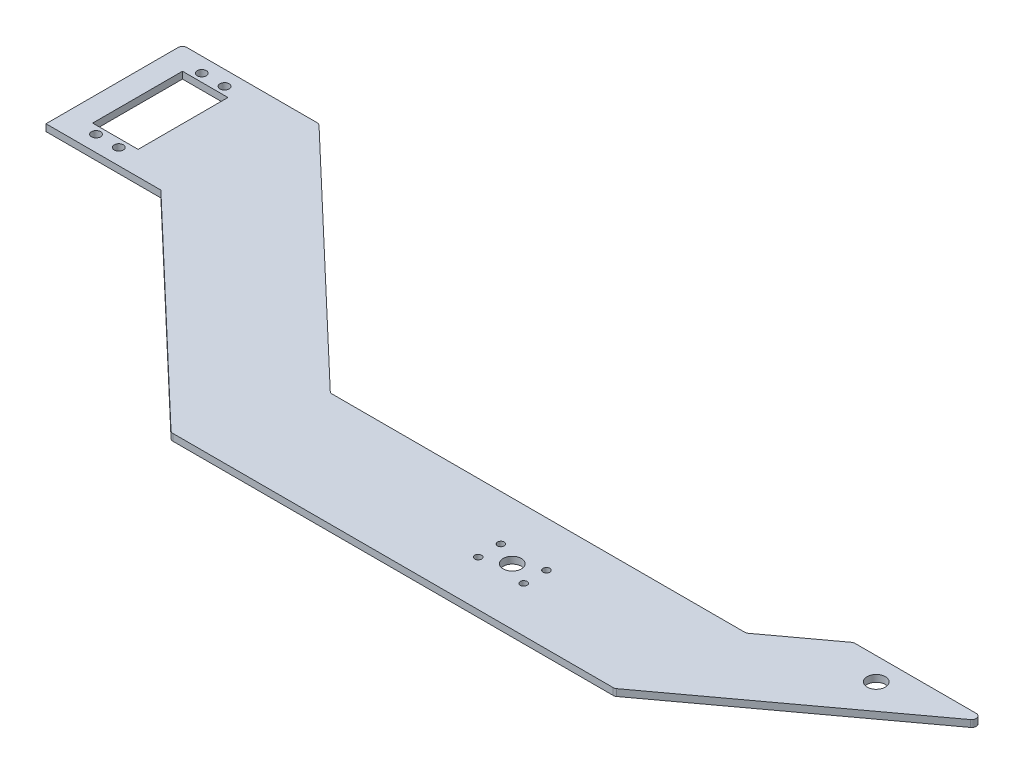
ISO-10303-21;
HEADER;
FILE_DESCRIPTION(('STEP AP214'),'2;1');
FILE_NAME('part.step','',(''),(''),'','','');
FILE_SCHEMA(('AUTOMOTIVE_DESIGN { 1 0 10303 214 1 1 1 1 }'));
ENDSEC;
DATA;
#1=APPLICATION_CONTEXT('core data for automotive mechanical design processes');
#2=APPLICATION_PROTOCOL_DEFINITION('international standard','automotive_design',2000,#1);
#3=PRODUCT_CONTEXT('',#1,'mechanical');
#4=PRODUCT('Part','Part','',(#3));
#5=PRODUCT_RELATED_PRODUCT_CATEGORY('part','',(#4));
#6=PRODUCT_DEFINITION_FORMATION('','',#4);
#7=PRODUCT_DEFINITION_CONTEXT('part definition',#1,'design');
#8=PRODUCT_DEFINITION('design','',#6,#7);
#9=PRODUCT_DEFINITION_SHAPE('','',#8);
#10=(LENGTH_UNIT() NAMED_UNIT(*) SI_UNIT(.MILLI.,.METRE.));
#11=(NAMED_UNIT(*) PLANE_ANGLE_UNIT() SI_UNIT($,.RADIAN.));
#12=(NAMED_UNIT(*) SI_UNIT($,.STERADIAN.) SOLID_ANGLE_UNIT());
#13=UNCERTAINTY_MEASURE_WITH_UNIT(LENGTH_MEASURE(1.E-05),#10,'distance_accuracy_value','');
#14=(GEOMETRIC_REPRESENTATION_CONTEXT(3) GLOBAL_UNCERTAINTY_ASSIGNED_CONTEXT((#13)) GLOBAL_UNIT_ASSIGNED_CONTEXT((#10,
#11,#12)) REPRESENTATION_CONTEXT('',''));
#15=CARTESIAN_POINT('',(0.,0.,0.));
#16=DIRECTION('',(0.,0.,1.));
#17=DIRECTION('',(1.,0.,0.));
#18=AXIS2_PLACEMENT_3D('',#15,#16,#17);
#19=CARTESIAN_POINT('',(-124.2,0.,148.));
#20=DIRECTION('',(0.,1.,0.));
#21=DIRECTION('',(0.,0.,1.));
#22=AXIS2_PLACEMENT_3D('',#19,#20,#21);
#23=CYLINDRICAL_SURFACE('',#22,2.);
#24=CARTESIAN_POINT('',(-124.2,0.,148.));
#25=DIRECTION('',(0.,1.,0.));
#26=DIRECTION('',(0.,0.,1.));
#27=AXIS2_PLACEMENT_3D('',#24,#25,#26);
#28=CIRCLE('',#27,2.);
#29=CARTESIAN_POINT('',(-125.579310344828,0.,149.448275862069));
#30=VERTEX_POINT('',#29);
#31=CARTESIAN_POINT('',(-124.2,0.,150.));
#32=VERTEX_POINT('',#31);
#33=EDGE_CURVE('E20',#30,#32,#28,.T.);
#34=ORIENTED_EDGE('',*,*,#33,.T.);
#35=DIRECTION('',(0.,1.,0.));
#36=VECTOR('',#35,1.);
#37=CARTESIAN_POINT('',(-124.2,0.,150.));
#38=LINE('',#37,#36);
#39=CARTESIAN_POINT('',(-124.2,3.,150.));
#40=VERTEX_POINT('',#39);
#41=EDGE_CURVE('E170',#40,#32,#38,.F.);
#42=ORIENTED_EDGE('',*,*,#41,.F.);
#43=CARTESIAN_POINT('',(-124.2,3.,148.));
#44=DIRECTION('',(0.,1.,0.));
#45=DIRECTION('',(0.,0.,1.));
#46=AXIS2_PLACEMENT_3D('',#43,#44,#45);
#47=CIRCLE('',#46,2.);
#48=CARTESIAN_POINT('',(-125.579310344828,3.,149.448275862069));
#49=VERTEX_POINT('',#48);
#50=EDGE_CURVE('E378',#49,#40,#47,.T.);
#51=ORIENTED_EDGE('',*,*,#50,.F.);
#52=DIRECTION('',(0.,1.,0.));
#53=VECTOR('',#52,1.);
#54=CARTESIAN_POINT('',(-125.579310344828,0.,149.448275862069));
#55=LINE('',#54,#53);
#56=EDGE_CURVE('E171',#30,#49,#55,.T.);
#57=ORIENTED_EDGE('',*,*,#56,.F.);
#58=EDGE_LOOP('',(#34,#42,#51,#57));
#59=FACE_BOUND('',#58,.T.);
#60=ADVANCED_FACE('F17',(#59),#23,.T.);
#61=CARTESIAN_POINT('',(69.3427360796554,0.,148.));
#62=DIRECTION('',(0.,1.,0.));
#63=DIRECTION('',(0.,0.,1.));
#64=AXIS2_PLACEMENT_3D('',#61,#62,#63);
#65=CYLINDRICAL_SURFACE('',#64,2.);
#66=CARTESIAN_POINT('',(69.3427360796554,0.,148.));
#67=DIRECTION('',(0.,1.,0.));
#68=DIRECTION('',(0.,0.,1.));
#69=AXIS2_PLACEMENT_3D('',#66,#67,#68);
#70=CIRCLE('',#69,2.);
#71=CARTESIAN_POINT('',(69.3427360796554,0.,150.));
#72=VERTEX_POINT('',#71);
#73=CARTESIAN_POINT('',(70.5291341557551,0.,149.610111674707));
#74=VERTEX_POINT('',#73);
#75=EDGE_CURVE('E173',#72,#74,#70,.T.);
#76=ORIENTED_EDGE('',*,*,#75,.T.);
#77=DIRECTION('',(0.,1.,0.));
#78=VECTOR('',#77,1.);
#79=CARTESIAN_POINT('',(70.529134155755,0.,149.610111674707));
#80=LINE('',#79,#78);
#81=CARTESIAN_POINT('',(70.529134155755,3.,149.610111674707));
#82=VERTEX_POINT('',#81);
#83=EDGE_CURVE('E264',#82,#74,#80,.F.);
#84=ORIENTED_EDGE('',*,*,#83,.F.);
#85=CARTESIAN_POINT('',(69.3427360796554,3.,148.));
#86=DIRECTION('',(0.,1.,0.));
#87=DIRECTION('',(0.,0.,1.));
#88=AXIS2_PLACEMENT_3D('',#85,#86,#87);
#89=CIRCLE('',#88,2.);
#90=CARTESIAN_POINT('',(69.3427360796554,3.,150.));
#91=VERTEX_POINT('',#90);
#92=EDGE_CURVE('E376',#91,#82,#89,.T.);
#93=ORIENTED_EDGE('',*,*,#92,.F.);
#94=DIRECTION('',(0.,1.,0.));
#95=VECTOR('',#94,1.);
#96=CARTESIAN_POINT('',(69.3427360796554,0.,150.));
#97=LINE('',#96,#95);
#98=EDGE_CURVE('E181',#72,#91,#97,.T.);
#99=ORIENTED_EDGE('',*,*,#98,.F.);
#100=EDGE_LOOP('',(#76,#84,#93,#99));
#101=FACE_BOUND('',#100,.T.);
#102=ADVANCED_FACE('F389',(#101),#65,.T.);
#103=CARTESIAN_POINT('',(105.657263920345,0.,82.));
#104=DIRECTION('',(0.,1.,0.));
#105=DIRECTION('',(0.,0.,1.));
#106=AXIS2_PLACEMENT_3D('',#103,#104,#105);
#107=CYLINDRICAL_SURFACE('',#106,2.);
#108=CARTESIAN_POINT('',(105.657263920345,0.,82.));
#109=DIRECTION('',(0.,1.,0.));
#110=DIRECTION('',(0.,0.,1.));
#111=AXIS2_PLACEMENT_3D('',#108,#109,#110);
#112=CIRCLE('',#111,2.);
#113=CARTESIAN_POINT('',(105.657263920345,0.,80.));
#114=VERTEX_POINT('',#113);
#115=CARTESIAN_POINT('',(104.470865844245,0.,80.3898883252931));
#116=VERTEX_POINT('',#115);
#117=EDGE_CURVE('E386',#114,#116,#112,.T.);
#118=ORIENTED_EDGE('',*,*,#117,.T.);
#119=DIRECTION('',(0.,1.,0.));
#120=VECTOR('',#119,1.);
#121=CARTESIAN_POINT('',(104.470865844245,0.,80.3898883252931));
#122=LINE('',#121,#120);
#123=CARTESIAN_POINT('',(104.470865844245,3.,80.389888325293));
#124=VERTEX_POINT('',#123);
#125=EDGE_CURVE('E251',#124,#116,#122,.F.);
#126=ORIENTED_EDGE('',*,*,#125,.F.);
#127=CARTESIAN_POINT('',(105.657263920345,3.,82.));
#128=DIRECTION('',(0.,1.,0.));
#129=DIRECTION('',(0.,0.,1.));
#130=AXIS2_PLACEMENT_3D('',#127,#128,#129);
#131=CIRCLE('',#130,2.);
#132=CARTESIAN_POINT('',(105.657263920345,3.,80.));
#133=VERTEX_POINT('',#132);
#134=EDGE_CURVE('E374',#133,#124,#131,.T.);
#135=ORIENTED_EDGE('',*,*,#134,.F.);
#136=DIRECTION('',(0.,1.,0.));
#137=VECTOR('',#136,1.);
#138=CARTESIAN_POINT('',(105.657263920345,0.,80.));
#139=LINE('',#138,#137);
#140=EDGE_CURVE('E259',#114,#133,#139,.T.);
#141=ORIENTED_EDGE('',*,*,#140,.F.);
#142=EDGE_LOOP('',(#118,#126,#135,#141));
#143=FACE_BOUND('',#142,.T.);
#144=ADVANCED_FACE('F449',(#143),#107,.T.);
#145=CARTESIAN_POINT('',(77.1998789367983,0.,98.));
#146=DIRECTION('',(0.,1.,0.));
#147=DIRECTION('',(0.,0.,1.));
#148=AXIS2_PLACEMENT_3D('',#145,#146,#147);
#149=CYLINDRICAL_SURFACE('',#148,2.);
#150=DIRECTION('',(0.,1.,0.));
#151=VECTOR('',#150,1.);
#152=CARTESIAN_POINT('',(77.1998789367983,0.,100.));
#153=LINE('',#152,#151);
#154=CARTESIAN_POINT('',(77.1998789367983,3.,100.));
#155=VERTEX_POINT('',#154);
#156=CARTESIAN_POINT('',(77.1998789367983,0.,100.));
#157=VERTEX_POINT('',#156);
#158=EDGE_CURVE('E244',#155,#157,#153,.F.);
#159=ORIENTED_EDGE('',*,*,#158,.F.);
#160=CARTESIAN_POINT('',(77.1998789367983,3.,98.));
#161=DIRECTION('',(0.,1.,0.));
#162=DIRECTION('',(0.,0.,1.));
#163=AXIS2_PLACEMENT_3D('',#160,#161,#162);
#164=CIRCLE('',#163,2.);
#165=CARTESIAN_POINT('',(78.386277012898,3.,99.6101116747067));
#166=VERTEX_POINT('',#165);
#167=EDGE_CURVE('E372',#166,#155,#164,.F.);
#168=ORIENTED_EDGE('',*,*,#167,.F.);
#169=DIRECTION('',(0.,1.,0.));
#170=VECTOR('',#169,1.);
#171=CARTESIAN_POINT('',(78.386277012898,0.,99.6101116747067));
#172=LINE('',#171,#170);
#173=CARTESIAN_POINT('',(78.386277012898,0.,99.6101116747067));
#174=VERTEX_POINT('',#173);
#175=EDGE_CURVE('E254',#174,#166,#172,.T.);
#176=ORIENTED_EDGE('',*,*,#175,.F.);
#177=CARTESIAN_POINT('',(77.1998789367983,0.,98.));
#178=DIRECTION('',(0.,1.,0.));
#179=DIRECTION('',(0.,0.,1.));
#180=AXIS2_PLACEMENT_3D('',#177,#178,#179);
#181=CIRCLE('',#180,2.);
#182=EDGE_CURVE('E384',#157,#174,#181,.T.);
#183=ORIENTED_EDGE('',*,*,#182,.F.);
#184=EDGE_LOOP('',(#159,#168,#176,#183));
#185=FACE_BOUND('',#184,.T.);
#186=ADVANCED_FACE('F453',(#185),#149,.F.);
#187=CARTESIAN_POINT('',(-104.2,0.,98.0000000000001));
#188=DIRECTION('',(0.,1.,0.));
#189=DIRECTION('',(0.,0.,1.));
#190=AXIS2_PLACEMENT_3D('',#187,#188,#189);
#191=CYLINDRICAL_SURFACE('',#190,2.);
#192=DIRECTION('',(0.,1.,0.));
#193=VECTOR('',#192,1.);
#194=CARTESIAN_POINT('',(-105.579310344828,0.,99.4482758620688));
#195=LINE('',#194,#193);
#196=CARTESIAN_POINT('',(-105.579310344828,3.,99.4482758620689));
#197=VERTEX_POINT('',#196);
#198=CARTESIAN_POINT('',(-105.579310344828,0.,99.448275862069));
#199=VERTEX_POINT('',#198);
#200=EDGE_CURVE('E238',#197,#199,#195,.F.);
#201=ORIENTED_EDGE('',*,*,#200,.F.);
#202=CARTESIAN_POINT('',(-104.2,3.,98.0000000000001));
#203=DIRECTION('',(0.,1.,0.));
#204=DIRECTION('',(0.,0.,1.));
#205=AXIS2_PLACEMENT_3D('',#202,#203,#204);
#206=CIRCLE('',#205,2.);
#207=CARTESIAN_POINT('',(-104.2,3.,100.));
#208=VERTEX_POINT('',#207);
#209=EDGE_CURVE('E370',#208,#197,#206,.F.);
#210=ORIENTED_EDGE('',*,*,#209,.F.);
#211=DIRECTION('',(0.,1.,0.));
#212=VECTOR('',#211,1.);
#213=CARTESIAN_POINT('',(-104.2,0.,100.));
#214=LINE('',#213,#212);
#215=CARTESIAN_POINT('',(-104.2,0.,100.));
#216=VERTEX_POINT('',#215);
#217=EDGE_CURVE('E248',#216,#208,#214,.T.);
#218=ORIENTED_EDGE('',*,*,#217,.F.);
#219=CARTESIAN_POINT('',(-104.2,0.,98.0000000000001));
#220=DIRECTION('',(0.,1.,0.));
#221=DIRECTION('',(0.,0.,1.));
#222=AXIS2_PLACEMENT_3D('',#219,#220,#221);
#223=CIRCLE('',#222,2.);
#224=EDGE_CURVE('E382',#199,#216,#223,.T.);
#225=ORIENTED_EDGE('',*,*,#224,.F.);
#226=EDGE_LOOP('',(#201,#210,#218,#225));
#227=FACE_BOUND('',#226,.T.);
#228=ADVANCED_FACE('F461',(#227),#191,.F.);
#229=CARTESIAN_POINT('',(-210.8,0.,1.99999999999999));
#230=DIRECTION('',(0.,1.,0.));
#231=DIRECTION('',(0.,0.,1.));
#232=AXIS2_PLACEMENT_3D('',#229,#230,#231);
#233=CYLINDRICAL_SURFACE('',#232,2.);
#234=CARTESIAN_POINT('',(-210.8,0.,1.99999999999999));
#235=DIRECTION('',(0.,1.,0.));
#236=DIRECTION('',(0.,0.,1.));
#237=AXIS2_PLACEMENT_3D('',#234,#235,#236);
#238=CIRCLE('',#237,2.);
#239=CARTESIAN_POINT('',(-209.420689655172,0.,0.551724137931043));
#240=VERTEX_POINT('',#239);
#241=CARTESIAN_POINT('',(-210.8,0.,0.));
#242=VERTEX_POINT('',#241);
#243=EDGE_CURVE('E380',#240,#242,#238,.T.);
#244=ORIENTED_EDGE('',*,*,#243,.T.);
#245=DIRECTION('',(0.,1.,0.));
#246=VECTOR('',#245,1.);
#247=CARTESIAN_POINT('',(-210.8,0.,0.));
#248=LINE('',#247,#246);
#249=CARTESIAN_POINT('',(-210.8,3.,0.));
#250=VERTEX_POINT('',#249);
#251=EDGE_CURVE('E234',#250,#242,#248,.F.);
#252=ORIENTED_EDGE('',*,*,#251,.F.);
#253=CARTESIAN_POINT('',(-210.8,3.,1.99999999999999));
#254=DIRECTION('',(0.,1.,0.));
#255=DIRECTION('',(0.,0.,1.));
#256=AXIS2_PLACEMENT_3D('',#253,#254,#255);
#257=CIRCLE('',#256,2.);
#258=CARTESIAN_POINT('',(-209.420689655172,3.,0.551724137931164));
#259=VERTEX_POINT('',#258);
#260=EDGE_CURVE('E285',#259,#250,#257,.T.);
#261=ORIENTED_EDGE('',*,*,#260,.F.);
#262=DIRECTION('',(0.,1.,0.));
#263=VECTOR('',#262,1.);
#264=CARTESIAN_POINT('',(-209.420689655172,0.,0.551724137931267));
#265=LINE('',#264,#263);
#266=EDGE_CURVE('E242',#240,#259,#265,.T.);
#267=ORIENTED_EDGE('',*,*,#266,.F.);
#268=EDGE_LOOP('',(#244,#252,#261,#267));
#269=FACE_BOUND('',#268,.T.);
#270=ADVANCED_FACE('F469',(#269),#233,.T.);
#271=CARTESIAN_POINT('',(74.5377159777268,3.,112.165991005954));
#272=DIRECTION('',(0.,1.,0.));
#273=DIRECTION('',(0.,0.,1.));
#274=AXIS2_PLACEMENT_3D('',#271,#272,#273);
#275=PLANE('',#274);
#276=CARTESIAN_POINT('',(125.,3.,90.));
#277=DIRECTION('',(0.,-1.,0.));
#278=DIRECTION('',(0.,0.,-1.));
#279=AXIS2_PLACEMENT_3D('',#276,#277,#278);
#280=CIRCLE('',#279,4.00000000000001);
#281=CARTESIAN_POINT('',(125.,3.,86.));
#282=VERTEX_POINT('',#281);
#283=EDGE_CURVE('E203',#282,#282,#280,.T.);
#284=ORIENTED_EDGE('',*,*,#283,.T.);
#285=EDGE_LOOP('',(#284));
#286=FACE_BOUND('',#285,.T.);
#287=CARTESIAN_POINT('',(0.,3.,125.));
#288=DIRECTION('',(0.,-1.,0.));
#289=DIRECTION('',(0.,0.,-1.));
#290=AXIS2_PLACEMENT_3D('',#287,#288,#289);
#291=CIRCLE('',#290,4.);
#292=CARTESIAN_POINT('',(0.,3.,121.));
#293=VERTEX_POINT('',#292);
#294=EDGE_CURVE('E209',#293,#293,#291,.T.);
#295=ORIENTED_EDGE('',*,*,#294,.T.);
#296=EDGE_LOOP('',(#295));
#297=FACE_BOUND('',#296,.T.);
#298=DIRECTION('',(0.,0.,1.));
#299=VECTOR('',#298,1.);
#300=CARTESIAN_POINT('',(-260.,3.,9.99999999999999));
#301=LINE('',#300,#299);
#302=CARTESIAN_POINT('',(-260.,3.,49.5));
#303=VERTEX_POINT('',#302);
#304=CARTESIAN_POINT('',(-260.,3.,9.99999999999999));
#305=VERTEX_POINT('',#304);
#306=EDGE_CURVE('E219',#303,#305,#301,.F.);
#307=ORIENTED_EDGE('',*,*,#306,.T.);
#308=DIRECTION('',(-1.,0.,0.));
#309=VECTOR('',#308,1.);
#310=CARTESIAN_POINT('',(-240.,3.,9.99999999999999));
#311=LINE('',#310,#309);
#312=CARTESIAN_POINT('',(-240.,3.,9.99999999999999));
#313=VERTEX_POINT('',#312);
#314=EDGE_CURVE('E214',#305,#313,#311,.F.);
#315=ORIENTED_EDGE('',*,*,#314,.T.);
#316=DIRECTION('',(0.,0.,-1.));
#317=VECTOR('',#316,1.);
#318=CARTESIAN_POINT('',(-240.,3.,49.5));
#319=LINE('',#318,#317);
#320=CARTESIAN_POINT('',(-240.,3.,49.5));
#321=VERTEX_POINT('',#320);
#322=EDGE_CURVE('E206',#313,#321,#319,.F.);
#323=ORIENTED_EDGE('',*,*,#322,.T.);
#324=DIRECTION('',(1.,0.,0.));
#325=VECTOR('',#324,1.);
#326=CARTESIAN_POINT('',(-260.,3.,49.5));
#327=LINE('',#326,#325);
#328=EDGE_CURVE('E224',#321,#303,#327,.F.);
#329=ORIENTED_EDGE('',*,*,#328,.T.);
#330=EDGE_LOOP('',(#307,#315,#323,#329));
#331=FACE_BOUND('',#330,.T.);
#332=CARTESIAN_POINT('',(-255.,3.,6.5));
#333=DIRECTION('',(0.,1.,0.));
#334=DIRECTION('',(0.,0.,1.));
#335=AXIS2_PLACEMENT_3D('',#332,#333,#334);
#336=CIRCLE('',#335,1.99999999999999);
#337=CARTESIAN_POINT('',(-255.,3.,8.49999999999999));
#338=VERTEX_POINT('',#337);
#339=EDGE_CURVE('E226',#338,#338,#336,.F.);
#340=ORIENTED_EDGE('',*,*,#339,.T.);
#341=EDGE_LOOP('',(#340));
#342=FACE_BOUND('',#341,.T.);
#343=CARTESIAN_POINT('',(-255.,3.,53.));
#344=DIRECTION('',(0.,1.,0.));
#345=DIRECTION('',(0.,0.,1.));
#346=AXIS2_PLACEMENT_3D('',#343,#344,#345);
#347=CIRCLE('',#346,2.);
#348=CARTESIAN_POINT('',(-255.,3.,55.));
#349=VERTEX_POINT('',#348);
#350=EDGE_CURVE('E347',#349,#349,#347,.F.);
#351=ORIENTED_EDGE('',*,*,#350,.T.);
#352=EDGE_LOOP('',(#351));
#353=FACE_BOUND('',#352,.T.);
#354=CARTESIAN_POINT('',(-245.,3.,53.));
#355=DIRECTION('',(0.,1.,0.));
#356=DIRECTION('',(0.,0.,1.));
#357=AXIS2_PLACEMENT_3D('',#354,#355,#356);
#358=CIRCLE('',#357,2.);
#359=CARTESIAN_POINT('',(-245.,3.,55.));
#360=VERTEX_POINT('',#359);
#361=EDGE_CURVE('E350',#360,#360,#358,.F.);
#362=ORIENTED_EDGE('',*,*,#361,.T.);
#363=EDGE_LOOP('',(#362));
#364=FACE_BOUND('',#363,.T.);
#365=CARTESIAN_POINT('',(-245.,3.,6.5));
#366=DIRECTION('',(0.,1.,0.));
#367=DIRECTION('',(0.,0.,1.));
#368=AXIS2_PLACEMENT_3D('',#365,#366,#367);
#369=CIRCLE('',#368,1.99999999999999);
#370=CARTESIAN_POINT('',(-245.,3.,8.49999999999999));
#371=VERTEX_POINT('',#370);
#372=EDGE_CURVE('E353',#371,#371,#369,.F.);
#373=ORIENTED_EDGE('',*,*,#372,.T.);
#374=EDGE_LOOP('',(#373));
#375=FACE_BOUND('',#374,.T.);
#376=CARTESIAN_POINT('',(-10.,3.,120.));
#377=DIRECTION('',(0.,-1.,0.));
#378=DIRECTION('',(0.,0.,-1.));
#379=AXIS2_PLACEMENT_3D('',#376,#377,#378);
#380=CIRCLE('',#379,1.49999999999999);
#381=CARTESIAN_POINT('',(-10.,3.,118.5));
#382=VERTEX_POINT('',#381);
#383=EDGE_CURVE('E356',#382,#382,#380,.T.);
#384=ORIENTED_EDGE('',*,*,#383,.T.);
#385=EDGE_LOOP('',(#384));
#386=FACE_BOUND('',#385,.T.);
#387=CARTESIAN_POINT('',(10.,3.,120.));
#388=DIRECTION('',(0.,-1.,0.));
#389=DIRECTION('',(0.,0.,-1.));
#390=AXIS2_PLACEMENT_3D('',#387,#388,#389);
#391=CIRCLE('',#390,1.49999999999999);
#392=CARTESIAN_POINT('',(10.,3.,118.5));
#393=VERTEX_POINT('',#392);
#394=EDGE_CURVE('E359',#393,#393,#391,.T.);
#395=ORIENTED_EDGE('',*,*,#394,.T.);
#396=EDGE_LOOP('',(#395));
#397=FACE_BOUND('',#396,.T.);
#398=CARTESIAN_POINT('',(10.,3.,130.));
#399=DIRECTION('',(0.,-1.,0.));
#400=DIRECTION('',(0.,0.,-1.));
#401=AXIS2_PLACEMENT_3D('',#398,#399,#400);
#402=CIRCLE('',#401,1.49999999999999);
#403=CARTESIAN_POINT('',(10.,3.,128.5));
#404=VERTEX_POINT('',#403);
#405=EDGE_CURVE('E362',#404,#404,#402,.T.);
#406=ORIENTED_EDGE('',*,*,#405,.T.);
#407=EDGE_LOOP('',(#406));
#408=FACE_BOUND('',#407,.T.);
#409=CARTESIAN_POINT('',(-10.,3.,130.));
#410=DIRECTION('',(0.,-1.,0.));
#411=DIRECTION('',(0.,0.,-1.));
#412=AXIS2_PLACEMENT_3D('',#409,#410,#411);
#413=CIRCLE('',#412,1.49999999999999);
#414=CARTESIAN_POINT('',(-10.,3.,128.5));
#415=VERTEX_POINT('',#414);
#416=EDGE_CURVE('E233',#415,#415,#413,.T.);
#417=ORIENTED_EDGE('',*,*,#416,.T.);
#418=EDGE_LOOP('',(#417));
#419=FACE_BOUND('',#418,.T.);
#420=ORIENTED_EDGE('',*,*,#260,.T.);
#421=DIRECTION('',(-1.,0.,0.));
#422=VECTOR('',#421,1.);
#423=CARTESIAN_POINT('',(-210.,3.,0.));
#424=LINE('',#423,#422);
#425=CARTESIAN_POINT('',(-268.,3.,0.));
#426=VERTEX_POINT('',#425);
#427=EDGE_CURVE('E237',#426,#250,#424,.F.);
#428=ORIENTED_EDGE('',*,*,#427,.F.);
#429=CARTESIAN_POINT('',(-268.,3.,2.));
#430=DIRECTION('',(0.,1.,0.));
#431=DIRECTION('',(0.,0.,1.));
#432=AXIS2_PLACEMENT_3D('',#429,#430,#431);
#433=CIRCLE('',#432,2.);
#434=CARTESIAN_POINT('',(-270.,3.,2.));
#435=VERTEX_POINT('',#434);
#436=EDGE_CURVE('E230',#435,#426,#433,.F.);
#437=ORIENTED_EDGE('',*,*,#436,.F.);
#438=DIRECTION('',(0.,0.,1.));
#439=VECTOR('',#438,1.);
#440=CARTESIAN_POINT('',(-270.,3.,0.));
#441=LINE('',#440,#439);
#442=CARTESIAN_POINT('',(-270.,3.,60.));
#443=VERTEX_POINT('',#442);
#444=EDGE_CURVE('E283',#443,#435,#441,.F.);
#445=ORIENTED_EDGE('',*,*,#444,.F.);
#446=DIRECTION('',(1.,0.,0.));
#447=VECTOR('',#446,1.);
#448=CARTESIAN_POINT('',(-270.,3.,60.));
#449=LINE('',#448,#447);
#450=CARTESIAN_POINT('',(-219.5,3.,60.));
#451=VERTEX_POINT('',#450);
#452=EDGE_CURVE('E280',#451,#443,#449,.F.);
#453=ORIENTED_EDGE('',*,*,#452,.F.);
#454=DIRECTION('',(0.724137931034483,0.,0.689655172413793));
#455=VECTOR('',#454,1.);
#456=CARTESIAN_POINT('',(-219.5,3.,60.));
#457=LINE('',#456,#455);
#458=EDGE_CURVE('E270',#49,#451,#457,.F.);
#459=ORIENTED_EDGE('',*,*,#458,.F.);
#460=ORIENTED_EDGE('',*,*,#50,.T.);
#461=DIRECTION('',(1.,0.,0.));
#462=VECTOR('',#461,1.);
#463=CARTESIAN_POINT('',(0.,3.,150.));
#464=LINE('',#463,#462);
#465=EDGE_CURVE('E180',#91,#40,#464,.F.);
#466=ORIENTED_EDGE('',*,*,#465,.F.);
#467=ORIENTED_EDGE('',*,*,#92,.T.);
#468=DIRECTION('',(0.805055837353368,0.,-0.59319903804985));
#469=VECTOR('',#468,1.);
#470=CARTESIAN_POINT('',(70.,3.,150.));
#471=LINE('',#470,#469);
#472=CARTESIAN_POINT('',(160.100562727184,3.,83.6101116747067));
#473=VERTEX_POINT('',#472);
#474=EDGE_CURVE('E266',#473,#82,#471,.F.);
#475=ORIENTED_EDGE('',*,*,#474,.F.);
#476=CARTESIAN_POINT('',(158.914164651084,3.,82.));
#477=DIRECTION('',(0.,1.,0.));
#478=DIRECTION('',(0.,0.,1.));
#479=AXIS2_PLACEMENT_3D('',#476,#477,#478);
#480=CIRCLE('',#479,2.);
#481=CARTESIAN_POINT('',(158.914164651084,3.,80.));
#482=VERTEX_POINT('',#481);
#483=EDGE_CURVE('E263',#482,#473,#480,.F.);
#484=ORIENTED_EDGE('',*,*,#483,.F.);
#485=DIRECTION('',(-1.,0.,0.));
#486=VECTOR('',#485,1.);
#487=CARTESIAN_POINT('',(165.,3.,80.));
#488=LINE('',#487,#486);
#489=EDGE_CURVE('E258',#133,#482,#488,.F.);
#490=ORIENTED_EDGE('',*,*,#489,.F.);
#491=ORIENTED_EDGE('',*,*,#134,.T.);
#492=DIRECTION('',(-0.805055837353367,0.,0.593199038049851));
#493=VECTOR('',#492,1.);
#494=CARTESIAN_POINT('',(105.,3.,79.9999999999999));
#495=LINE('',#494,#493);
#496=EDGE_CURVE('E250',#166,#124,#495,.F.);
#497=ORIENTED_EDGE('',*,*,#496,.F.);
#498=ORIENTED_EDGE('',*,*,#167,.T.);
#499=DIRECTION('',(-1.,0.,0.));
#500=VECTOR('',#499,1.);
#501=CARTESIAN_POINT('',(77.8571428571429,3.,100.));
#502=LINE('',#501,#500);
#503=EDGE_CURVE('E247',#208,#155,#502,.F.);
#504=ORIENTED_EDGE('',*,*,#503,.F.);
#505=ORIENTED_EDGE('',*,*,#209,.T.);
#506=DIRECTION('',(-0.724137931034483,0.,-0.689655172413793));
#507=VECTOR('',#506,1.);
#508=CARTESIAN_POINT('',(-105.,3.,100.));
#509=LINE('',#508,#507);
#510=EDGE_CURVE('E241',#259,#197,#509,.F.);
#511=ORIENTED_EDGE('',*,*,#510,.F.);
#512=EDGE_LOOP('',(#420,#428,#437,#445,#453,#459,#460,#466,#467,#475,#484,#490,#491,#497,#498,
#504,#505,#511));
#513=FACE_BOUND('',#512,.T.);
#514=ADVANCED_FACE('F404',(#286,#297,#331,#342,#353,#364,#375,#386,#397,#408,#419,#513),#275,.T.);
#515=CARTESIAN_POINT('',(-270.,0.,0.));
#516=DIRECTION('',(-1.,0.,0.));
#517=DIRECTION('',(0.,0.,1.));
#518=AXIS2_PLACEMENT_3D('',#515,#516,#517);
#519=PLANE('',#518);
#520=DIRECTION('',(0.,1.,0.));
#521=VECTOR('',#520,1.);
#522=CARTESIAN_POINT('',(-270.,0.,60.));
#523=LINE('',#522,#521);
#524=CARTESIAN_POINT('',(-270.,0.,60.));
#525=VERTEX_POINT('',#524);
#526=EDGE_CURVE('E271',#443,#525,#523,.F.);
#527=ORIENTED_EDGE('',*,*,#526,.F.);
#528=ORIENTED_EDGE('',*,*,#444,.T.);
#529=DIRECTION('',(0.,1.,0.));
#530=VECTOR('',#529,1.);
#531=CARTESIAN_POINT('',(-270.,0.,2.));
#532=LINE('',#531,#530);
#533=CARTESIAN_POINT('',(-270.,0.,2.));
#534=VERTEX_POINT('',#533);
#535=EDGE_CURVE('E229',#534,#435,#532,.T.);
#536=ORIENTED_EDGE('',*,*,#535,.F.);
#537=DIRECTION('',(0.,0.,1.));
#538=VECTOR('',#537,1.);
#539=CARTESIAN_POINT('',(-270.,0.,112.165991005954));
#540=LINE('',#539,#538);
#541=EDGE_CURVE('E200',#534,#525,#540,.T.);
#542=ORIENTED_EDGE('',*,*,#541,.T.);
#543=EDGE_LOOP('',(#527,#528,#536,#542));
#544=FACE_BOUND('',#543,.T.);
#545=ADVANCED_FACE('F416',(#544),#519,.T.);
#546=CARTESIAN_POINT('',(-270.,0.,60.));
#547=DIRECTION('',(0.,0.,1.));
#548=DIRECTION('',(1.,0.,0.));
#549=AXIS2_PLACEMENT_3D('',#546,#547,#548);
#550=PLANE('',#549);
#551=ORIENTED_EDGE('',*,*,#452,.T.);
#552=ORIENTED_EDGE('',*,*,#526,.T.);
#553=DIRECTION('',(1.,0.,0.));
#554=VECTOR('',#553,1.);
#555=CARTESIAN_POINT('',(74.5377159777268,0.,60.));
#556=LINE('',#555,#554);
#557=CARTESIAN_POINT('',(-219.5,0.,60.));
#558=VERTEX_POINT('',#557);
#559=EDGE_CURVE('E194',#525,#558,#556,.T.);
#560=ORIENTED_EDGE('',*,*,#559,.T.);
#561=DIRECTION('',(0.,1.,0.));
#562=VECTOR('',#561,1.);
#563=CARTESIAN_POINT('',(-219.5,0.,60.));
#564=LINE('',#563,#562);
#565=EDGE_CURVE('E182',#451,#558,#564,.F.);
#566=ORIENTED_EDGE('',*,*,#565,.F.);
#567=EDGE_LOOP('',(#551,#552,#560,#566));
#568=FACE_BOUND('',#567,.T.);
#569=ADVANCED_FACE('F413',(#568),#550,.T.);
#570=CARTESIAN_POINT('',(-219.5,0.,60.));
#571=DIRECTION('',(-0.689655172413793,0.,0.724137931034483));
#572=DIRECTION('',(0.724137931034483,0.,0.689655172413793));
#573=AXIS2_PLACEMENT_3D('',#570,#571,#572);
#574=PLANE('',#573);
#575=ORIENTED_EDGE('',*,*,#565,.T.);
#576=DIRECTION('',(0.724137931034481,0.,0.689655172413795));
#577=VECTOR('',#576,1.);
#578=CARTESIAN_POINT('',(-219.5,0.,60.));
#579=LINE('',#578,#577);
#580=EDGE_CURVE('E189',#558,#30,#579,.T.);
#581=ORIENTED_EDGE('',*,*,#580,.T.);
#582=ORIENTED_EDGE('',*,*,#56,.T.);
#583=ORIENTED_EDGE('',*,*,#458,.T.);
#584=EDGE_LOOP('',(#575,#581,#582,#583));
#585=FACE_BOUND('',#584,.T.);
#586=ADVANCED_FACE('F410',(#585),#574,.T.);
#587=CARTESIAN_POINT('',(0.,0.,150.));
#588=DIRECTION('',(0.,0.,1.));
#589=DIRECTION('',(1.,0.,0.));
#590=AXIS2_PLACEMENT_3D('',#587,#588,#589);
#591=PLANE('',#590);
#592=ORIENTED_EDGE('',*,*,#98,.T.);
#593=ORIENTED_EDGE('',*,*,#465,.T.);
#594=ORIENTED_EDGE('',*,*,#41,.T.);
#595=DIRECTION('',(1.,0.,0.));
#596=VECTOR('',#595,1.);
#597=CARTESIAN_POINT('',(74.5377159777268,0.,150.));
#598=LINE('',#597,#596);
#599=EDGE_CURVE('E178',#32,#72,#598,.T.);
#600=ORIENTED_EDGE('',*,*,#599,.T.);
#601=EDGE_LOOP('',(#592,#593,#594,#600));
#602=FACE_BOUND('',#601,.T.);
#603=ADVANCED_FACE('F177',(#602),#591,.T.);
#604=CARTESIAN_POINT('',(70.,0.,150.));
#605=DIRECTION('',(0.59319903804985,0.,0.805055837353368));
#606=DIRECTION('',(0.805055837353368,0.,-0.59319903804985));
#607=AXIS2_PLACEMENT_3D('',#604,#605,#606);
#608=PLANE('',#607);
#609=DIRECTION('',(0.,1.,0.));
#610=VECTOR('',#609,1.);
#611=CARTESIAN_POINT('',(160.100562727184,0.,83.6101116747066));
#612=LINE('',#611,#610);
#613=CARTESIAN_POINT('',(160.100562727184,0.,83.6101116747067));
#614=VERTEX_POINT('',#613);
#615=EDGE_CURVE('E261',#473,#614,#612,.F.);
#616=ORIENTED_EDGE('',*,*,#615,.F.);
#617=ORIENTED_EDGE('',*,*,#474,.T.);
#618=ORIENTED_EDGE('',*,*,#83,.T.);
#619=DIRECTION('',(0.805055837353368,0.,-0.593199038049851));
#620=VECTOR('',#619,1.);
#621=CARTESIAN_POINT('',(70.5291341557551,0.,149.610111674707));
#622=LINE('',#621,#620);
#623=EDGE_CURVE('E188',#74,#614,#622,.T.);
#624=ORIENTED_EDGE('',*,*,#623,.T.);
#625=EDGE_LOOP('',(#616,#617,#618,#624));
#626=FACE_BOUND('',#625,.T.);
#627=ADVANCED_FACE('F393',(#626),#608,.T.);
#628=CARTESIAN_POINT('',(158.914164651084,0.,82.));
#629=DIRECTION('',(0.,1.,0.));
#630=DIRECTION('',(0.,0.,1.));
#631=AXIS2_PLACEMENT_3D('',#628,#629,#630);
#632=CYLINDRICAL_SURFACE('',#631,2.);
#633=CARTESIAN_POINT('',(158.914164651084,0.,82.));
#634=DIRECTION('',(0.,1.,0.));
#635=DIRECTION('',(0.,0.,1.));
#636=AXIS2_PLACEMENT_3D('',#633,#634,#635);
#637=CIRCLE('',#636,2.);
#638=CARTESIAN_POINT('',(158.914164651084,0.,80.));
#639=VERTEX_POINT('',#638);
#640=EDGE_CURVE('E192',#614,#639,#637,.T.);
#641=ORIENTED_EDGE('',*,*,#640,.T.);
#642=DIRECTION('',(0.,1.,0.));
#643=VECTOR('',#642,1.);
#644=CARTESIAN_POINT('',(158.914164651084,0.,80.));
#645=LINE('',#644,#643);
#646=EDGE_CURVE('E255',#482,#639,#645,.F.);
#647=ORIENTED_EDGE('',*,*,#646,.F.);
#648=ORIENTED_EDGE('',*,*,#483,.T.);
#649=ORIENTED_EDGE('',*,*,#615,.T.);
#650=EDGE_LOOP('',(#641,#647,#648,#649));
#651=FACE_BOUND('',#650,.T.);
#652=ADVANCED_FACE('F400',(#651),#632,.T.);
#653=CARTESIAN_POINT('',(165.,0.,80.));
#654=DIRECTION('',(0.,0.,-1.));
#655=DIRECTION('',(-1.,0.,0.));
#656=AXIS2_PLACEMENT_3D('',#653,#654,#655);
#657=PLANE('',#656);
#658=ORIENTED_EDGE('',*,*,#646,.T.);
#659=DIRECTION('',(1.,0.,0.));
#660=VECTOR('',#659,1.);
#661=CARTESIAN_POINT('',(74.5377159777268,0.,80.));
#662=LINE('',#661,#660);
#663=EDGE_CURVE('E340',#639,#114,#662,.F.);
#664=ORIENTED_EDGE('',*,*,#663,.T.);
#665=ORIENTED_EDGE('',*,*,#140,.T.);
#666=ORIENTED_EDGE('',*,*,#489,.T.);
#667=EDGE_LOOP('',(#658,#664,#665,#666));
#668=FACE_BOUND('',#667,.T.);
#669=ADVANCED_FACE('F438',(#668),#657,.T.);
#670=CARTESIAN_POINT('',(105.,0.,79.9999999999999));
#671=DIRECTION('',(-0.593199038049851,0.,-0.805055837353367));
#672=DIRECTION('',(-0.805055837353367,0.,0.593199038049851));
#673=AXIS2_PLACEMENT_3D('',#670,#671,#672);
#674=PLANE('',#673);
#675=ORIENTED_EDGE('',*,*,#175,.T.);
#676=ORIENTED_EDGE('',*,*,#496,.T.);
#677=ORIENTED_EDGE('',*,*,#125,.T.);
#678=DIRECTION('',(-0.805055837353369,0.,0.593199038049849));
#679=VECTOR('',#678,1.);
#680=CARTESIAN_POINT('',(104.470865844245,0.,80.3898883252932));
#681=LINE('',#680,#679);
#682=EDGE_CURVE('E435',#116,#174,#681,.T.);
#683=ORIENTED_EDGE('',*,*,#682,.T.);
#684=EDGE_LOOP('',(#675,#676,#677,#683));
#685=FACE_BOUND('',#684,.T.);
#686=ADVANCED_FACE('F445',(#685),#674,.T.);
#687=CARTESIAN_POINT('',(77.8571428571429,0.,100.));
#688=DIRECTION('',(0.,0.,-1.));
#689=DIRECTION('',(-1.,0.,0.));
#690=AXIS2_PLACEMENT_3D('',#687,#688,#689);
#691=PLANE('',#690);
#692=ORIENTED_EDGE('',*,*,#158,.T.);
#693=DIRECTION('',(1.,0.,0.));
#694=VECTOR('',#693,1.);
#695=CARTESIAN_POINT('',(74.5377159777268,0.,100.));
#696=LINE('',#695,#694);
#697=EDGE_CURVE('E428',#157,#216,#696,.F.);
#698=ORIENTED_EDGE('',*,*,#697,.T.);
#699=ORIENTED_EDGE('',*,*,#217,.T.);
#700=ORIENTED_EDGE('',*,*,#503,.T.);
#701=EDGE_LOOP('',(#692,#698,#699,#700));
#702=FACE_BOUND('',#701,.T.);
#703=ADVANCED_FACE('F456',(#702),#691,.T.);
#704=CARTESIAN_POINT('',(-105.,0.,100.));
#705=DIRECTION('',(0.689655172413793,0.,-0.724137931034483));
#706=DIRECTION('',(-0.724137931034483,0.,-0.689655172413793));
#707=AXIS2_PLACEMENT_3D('',#704,#705,#706);
#708=PLANE('',#707);
#709=ORIENTED_EDGE('',*,*,#200,.T.);
#710=DIRECTION('',(-0.72413793103448,0.,-0.689655172413796));
#711=VECTOR('',#710,1.);
#712=CARTESIAN_POINT('',(-105.579310344828,0.,99.448275862069));
#713=LINE('',#712,#711);
#714=EDGE_CURVE('E425',#199,#240,#713,.T.);
#715=ORIENTED_EDGE('',*,*,#714,.T.);
#716=ORIENTED_EDGE('',*,*,#266,.T.);
#717=ORIENTED_EDGE('',*,*,#510,.T.);
#718=EDGE_LOOP('',(#709,#715,#716,#717));
#719=FACE_BOUND('',#718,.T.);
#720=ADVANCED_FACE('F464',(#719),#708,.T.);
#721=CARTESIAN_POINT('',(-210.,0.,0.));
#722=DIRECTION('',(0.,0.,-1.));
#723=DIRECTION('',(-1.,0.,0.));
#724=AXIS2_PLACEMENT_3D('',#721,#722,#723);
#725=PLANE('',#724);
#726=ORIENTED_EDGE('',*,*,#251,.T.);
#727=DIRECTION('',(1.,0.,0.));
#728=VECTOR('',#727,1.);
#729=CARTESIAN_POINT('',(74.5377159777268,0.,0.));
#730=LINE('',#729,#728);
#731=CARTESIAN_POINT('',(-268.,0.,0.));
#732=VERTEX_POINT('',#731);
#733=EDGE_CURVE('E337',#242,#732,#730,.F.);
#734=ORIENTED_EDGE('',*,*,#733,.T.);
#735=DIRECTION('',(0.,1.,0.));
#736=VECTOR('',#735,1.);
#737=CARTESIAN_POINT('',(-268.,0.,0.));
#738=LINE('',#737,#736);
#739=EDGE_CURVE('E227',#426,#732,#738,.F.);
#740=ORIENTED_EDGE('',*,*,#739,.F.);
#741=ORIENTED_EDGE('',*,*,#427,.T.);
#742=EDGE_LOOP('',(#726,#734,#740,#741));
#743=FACE_BOUND('',#742,.T.);
#744=ADVANCED_FACE('F423',(#743),#725,.T.);
#745=CARTESIAN_POINT('',(-268.,0.,2.));
#746=DIRECTION('',(0.,1.,0.));
#747=DIRECTION('',(0.,0.,1.));
#748=AXIS2_PLACEMENT_3D('',#745,#746,#747);
#749=CYLINDRICAL_SURFACE('',#748,2.);
#750=CARTESIAN_POINT('',(-268.,0.,2.));
#751=DIRECTION('',(0.,1.,0.));
#752=DIRECTION('',(0.,0.,1.));
#753=AXIS2_PLACEMENT_3D('',#750,#751,#752);
#754=CIRCLE('',#753,2.);
#755=EDGE_CURVE('E334',#732,#534,#754,.T.);
#756=ORIENTED_EDGE('',*,*,#755,.T.);
#757=ORIENTED_EDGE('',*,*,#535,.T.);
#758=ORIENTED_EDGE('',*,*,#436,.T.);
#759=ORIENTED_EDGE('',*,*,#739,.T.);
#760=EDGE_LOOP('',(#756,#757,#758,#759));
#761=FACE_BOUND('',#760,.T.);
#762=ADVANCED_FACE('F472',(#761),#749,.T.);
#763=CARTESIAN_POINT('',(-10.,3.,130.));
#764=DIRECTION('',(0.,-1.,0.));
#765=DIRECTION('',(0.,0.,-1.));
#766=AXIS2_PLACEMENT_3D('',#763,#764,#765);
#767=CYLINDRICAL_SURFACE('',#766,1.49999999999999);
#768=ORIENTED_EDGE('',*,*,#416,.F.);
#769=EDGE_LOOP('',(#768));
#770=FACE_BOUND('',#769,.T.);
#771=CARTESIAN_POINT('',(-10.,0.,130.));
#772=DIRECTION('',(0.,-1.,0.));
#773=DIRECTION('',(0.,0.,-1.));
#774=AXIS2_PLACEMENT_3D('',#771,#772,#773);
#775=CIRCLE('',#774,1.49999999999999);
#776=CARTESIAN_POINT('',(-10.,0.,128.5));
#777=VERTEX_POINT('',#776);
#778=EDGE_CURVE('E331',#777,#777,#775,.T.);
#779=ORIENTED_EDGE('',*,*,#778,.T.);
#780=EDGE_LOOP('',(#779));
#781=FACE_BOUND('',#780,.T.);
#782=ADVANCED_FACE('F474',(#770,#781),#767,.F.);
#783=CARTESIAN_POINT('',(10.,3.,130.));
#784=DIRECTION('',(0.,-1.,0.));
#785=DIRECTION('',(0.,0.,-1.));
#786=AXIS2_PLACEMENT_3D('',#783,#784,#785);
#787=CYLINDRICAL_SURFACE('',#786,1.49999999999999);
#788=ORIENTED_EDGE('',*,*,#405,.F.);
#789=EDGE_LOOP('',(#788));
#790=FACE_BOUND('',#789,.T.);
#791=CARTESIAN_POINT('',(10.,0.,130.));
#792=DIRECTION('',(0.,-1.,0.));
#793=DIRECTION('',(0.,0.,-1.));
#794=AXIS2_PLACEMENT_3D('',#791,#792,#793);
#795=CIRCLE('',#794,1.49999999999999);
#796=CARTESIAN_POINT('',(10.,0.,128.5));
#797=VERTEX_POINT('',#796);
#798=EDGE_CURVE('E328',#797,#797,#795,.T.);
#799=ORIENTED_EDGE('',*,*,#798,.T.);
#800=EDGE_LOOP('',(#799));
#801=FACE_BOUND('',#800,.T.);
#802=ADVANCED_FACE('F481',(#790,#801),#787,.F.);
#803=CARTESIAN_POINT('',(10.,3.,120.));
#804=DIRECTION('',(0.,-1.,0.));
#805=DIRECTION('',(0.,0.,-1.));
#806=AXIS2_PLACEMENT_3D('',#803,#804,#805);
#807=CYLINDRICAL_SURFACE('',#806,1.49999999999999);
#808=ORIENTED_EDGE('',*,*,#394,.F.);
#809=EDGE_LOOP('',(#808));
#810=FACE_BOUND('',#809,.T.);
#811=CARTESIAN_POINT('',(10.,0.,120.));
#812=DIRECTION('',(0.,-1.,0.));
#813=DIRECTION('',(0.,0.,-1.));
#814=AXIS2_PLACEMENT_3D('',#811,#812,#813);
#815=CIRCLE('',#814,1.49999999999999);
#816=CARTESIAN_POINT('',(10.,0.,118.5));
#817=VERTEX_POINT('',#816);
#818=EDGE_CURVE('E325',#817,#817,#815,.T.);
#819=ORIENTED_EDGE('',*,*,#818,.T.);
#820=EDGE_LOOP('',(#819));
#821=FACE_BOUND('',#820,.T.);
#822=ADVANCED_FACE('F535',(#810,#821),#807,.F.);
#823=CARTESIAN_POINT('',(-10.,3.,120.));
#824=DIRECTION('',(0.,-1.,0.));
#825=DIRECTION('',(0.,0.,-1.));
#826=AXIS2_PLACEMENT_3D('',#823,#824,#825);
#827=CYLINDRICAL_SURFACE('',#826,1.49999999999999);
#828=ORIENTED_EDGE('',*,*,#383,.F.);
#829=EDGE_LOOP('',(#828));
#830=FACE_BOUND('',#829,.T.);
#831=CARTESIAN_POINT('',(-10.,0.,120.));
#832=DIRECTION('',(0.,-1.,0.));
#833=DIRECTION('',(0.,0.,-1.));
#834=AXIS2_PLACEMENT_3D('',#831,#832,#833);
#835=CIRCLE('',#834,1.49999999999999);
#836=CARTESIAN_POINT('',(-10.,0.,118.5));
#837=VERTEX_POINT('',#836);
#838=EDGE_CURVE('E322',#837,#837,#835,.T.);
#839=ORIENTED_EDGE('',*,*,#838,.T.);
#840=EDGE_LOOP('',(#839));
#841=FACE_BOUND('',#840,.T.);
#842=ADVANCED_FACE('F531',(#830,#841),#827,.F.);
#843=CARTESIAN_POINT('',(-245.,0.,6.5));
#844=DIRECTION('',(0.,1.,0.));
#845=DIRECTION('',(0.,0.,1.));
#846=AXIS2_PLACEMENT_3D('',#843,#844,#845);
#847=CYLINDRICAL_SURFACE('',#846,1.99999999999999);
#848=CARTESIAN_POINT('',(-245.,0.,6.5));
#849=DIRECTION('',(0.,1.,0.));
#850=DIRECTION('',(0.,0.,1.));
#851=AXIS2_PLACEMENT_3D('',#848,#849,#850);
#852=CIRCLE('',#851,1.99999999999999);
#853=CARTESIAN_POINT('',(-245.,0.,8.49999999999999));
#854=VERTEX_POINT('',#853);
#855=EDGE_CURVE('E319',#854,#854,#852,.F.);
#856=ORIENTED_EDGE('',*,*,#855,.T.);
#857=EDGE_LOOP('',(#856));
#858=FACE_BOUND('',#857,.T.);
#859=ORIENTED_EDGE('',*,*,#372,.F.);
#860=EDGE_LOOP('',(#859));
#861=FACE_BOUND('',#860,.T.);
#862=ADVANCED_FACE('F527',(#858,#861),#847,.F.);
#863=CARTESIAN_POINT('',(-245.,0.,53.));
#864=DIRECTION('',(0.,1.,0.));
#865=DIRECTION('',(0.,0.,1.));
#866=AXIS2_PLACEMENT_3D('',#863,#864,#865);
#867=CYLINDRICAL_SURFACE('',#866,2.);
#868=CARTESIAN_POINT('',(-245.,0.,53.));
#869=DIRECTION('',(0.,1.,0.));
#870=DIRECTION('',(0.,0.,1.));
#871=AXIS2_PLACEMENT_3D('',#868,#869,#870);
#872=CIRCLE('',#871,2.);
#873=CARTESIAN_POINT('',(-245.,0.,55.));
#874=VERTEX_POINT('',#873);
#875=EDGE_CURVE('E316',#874,#874,#872,.F.);
#876=ORIENTED_EDGE('',*,*,#875,.T.);
#877=EDGE_LOOP('',(#876));
#878=FACE_BOUND('',#877,.T.);
#879=ORIENTED_EDGE('',*,*,#361,.F.);
#880=EDGE_LOOP('',(#879));
#881=FACE_BOUND('',#880,.T.);
#882=ADVANCED_FACE('F523',(#878,#881),#867,.F.);
#883=CARTESIAN_POINT('',(-255.,0.,53.));
#884=DIRECTION('',(0.,1.,0.));
#885=DIRECTION('',(0.,0.,1.));
#886=AXIS2_PLACEMENT_3D('',#883,#884,#885);
#887=CYLINDRICAL_SURFACE('',#886,2.);
#888=CARTESIAN_POINT('',(-255.,0.,53.));
#889=DIRECTION('',(0.,1.,0.));
#890=DIRECTION('',(0.,0.,1.));
#891=AXIS2_PLACEMENT_3D('',#888,#889,#890);
#892=CIRCLE('',#891,2.);
#893=CARTESIAN_POINT('',(-255.,0.,55.));
#894=VERTEX_POINT('',#893);
#895=EDGE_CURVE('E313',#894,#894,#892,.F.);
#896=ORIENTED_EDGE('',*,*,#895,.T.);
#897=EDGE_LOOP('',(#896));
#898=FACE_BOUND('',#897,.T.);
#899=ORIENTED_EDGE('',*,*,#350,.F.);
#900=EDGE_LOOP('',(#899));
#901=FACE_BOUND('',#900,.T.);
#902=ADVANCED_FACE('F519',(#898,#901),#887,.F.);
#903=CARTESIAN_POINT('',(-255.,0.,6.5));
#904=DIRECTION('',(0.,1.,0.));
#905=DIRECTION('',(0.,0.,1.));
#906=AXIS2_PLACEMENT_3D('',#903,#904,#905);
#907=CYLINDRICAL_SURFACE('',#906,1.99999999999999);
#908=CARTESIAN_POINT('',(-255.,0.,6.5));
#909=DIRECTION('',(0.,1.,0.));
#910=DIRECTION('',(0.,0.,1.));
#911=AXIS2_PLACEMENT_3D('',#908,#909,#910);
#912=CIRCLE('',#911,1.99999999999999);
#913=CARTESIAN_POINT('',(-255.,0.,8.49999999999999));
#914=VERTEX_POINT('',#913);
#915=EDGE_CURVE('E309',#914,#914,#912,.F.);
#916=ORIENTED_EDGE('',*,*,#915,.T.);
#917=EDGE_LOOP('',(#916));
#918=FACE_BOUND('',#917,.T.);
#919=ORIENTED_EDGE('',*,*,#339,.F.);
#920=EDGE_LOOP('',(#919));
#921=FACE_BOUND('',#920,.T.);
#922=ADVANCED_FACE('F515',(#918,#921),#907,.F.);
#923=CARTESIAN_POINT('',(-260.,0.,49.5));
#924=DIRECTION('',(0.,0.,1.));
#925=DIRECTION('',(1.,0.,0.));
#926=AXIS2_PLACEMENT_3D('',#923,#924,#925);
#927=PLANE('',#926);
#928=DIRECTION('',(0.,1.,0.));
#929=VECTOR('',#928,1.);
#930=CARTESIAN_POINT('',(-240.,0.,49.5));
#931=LINE('',#930,#929);
#932=CARTESIAN_POINT('',(-240.,0.,49.5));
#933=VERTEX_POINT('',#932);
#934=EDGE_CURVE('E211',#321,#933,#931,.F.);
#935=ORIENTED_EDGE('',*,*,#934,.T.);
#936=DIRECTION('',(1.,0.,0.));
#937=VECTOR('',#936,1.);
#938=CARTESIAN_POINT('',(74.5377159777268,0.,49.5));
#939=LINE('',#938,#937);
#940=CARTESIAN_POINT('',(-260.,0.,49.5));
#941=VERTEX_POINT('',#940);
#942=EDGE_CURVE('E312',#933,#941,#939,.F.);
#943=ORIENTED_EDGE('',*,*,#942,.T.);
#944=DIRECTION('',(0.,1.,0.));
#945=VECTOR('',#944,1.);
#946=CARTESIAN_POINT('',(-260.,0.,49.5));
#947=LINE('',#946,#945);
#948=EDGE_CURVE('E221',#941,#303,#947,.T.);
#949=ORIENTED_EDGE('',*,*,#948,.T.);
#950=ORIENTED_EDGE('',*,*,#328,.F.);
#951=EDGE_LOOP('',(#935,#943,#949,#950));
#952=FACE_BOUND('',#951,.T.);
#953=ADVANCED_FACE('F511',(#952),#927,.F.);
#954=CARTESIAN_POINT('',(-260.,0.,9.99999999999999));
#955=DIRECTION('',(-1.,0.,0.));
#956=DIRECTION('',(0.,0.,1.));
#957=AXIS2_PLACEMENT_3D('',#954,#955,#956);
#958=PLANE('',#957);
#959=ORIENTED_EDGE('',*,*,#948,.F.);
#960=DIRECTION('',(0.,0.,1.));
#961=VECTOR('',#960,1.);
#962=CARTESIAN_POINT('',(-260.,0.,112.165991005954));
#963=LINE('',#962,#961);
#964=CARTESIAN_POINT('',(-260.,0.,9.99999999999999));
#965=VERTEX_POINT('',#964);
#966=EDGE_CURVE('E824',#941,#965,#963,.F.);
#967=ORIENTED_EDGE('',*,*,#966,.T.);
#968=DIRECTION('',(0.,1.,0.));
#969=VECTOR('',#968,1.);
#970=CARTESIAN_POINT('',(-260.,0.,9.99999999999999));
#971=LINE('',#970,#969);
#972=EDGE_CURVE('E216',#965,#305,#971,.T.);
#973=ORIENTED_EDGE('',*,*,#972,.T.);
#974=ORIENTED_EDGE('',*,*,#306,.F.);
#975=EDGE_LOOP('',(#959,#967,#973,#974));
#976=FACE_BOUND('',#975,.T.);
#977=ADVANCED_FACE('F507',(#976),#958,.F.);
#978=CARTESIAN_POINT('',(-240.,0.,9.99999999999999));
#979=DIRECTION('',(0.,0.,-1.));
#980=DIRECTION('',(-1.,0.,0.));
#981=AXIS2_PLACEMENT_3D('',#978,#979,#980);
#982=PLANE('',#981);
#983=ORIENTED_EDGE('',*,*,#972,.F.);
#984=DIRECTION('',(1.,0.,0.));
#985=VECTOR('',#984,1.);
#986=CARTESIAN_POINT('',(74.5377159777268,0.,9.99999999999999));
#987=LINE('',#986,#985);
#988=CARTESIAN_POINT('',(-240.,0.,9.99999999999999));
#989=VERTEX_POINT('',#988);
#990=EDGE_CURVE('E827',#965,#989,#987,.T.);
#991=ORIENTED_EDGE('',*,*,#990,.T.);
#992=DIRECTION('',(0.,1.,0.));
#993=VECTOR('',#992,1.);
#994=CARTESIAN_POINT('',(-240.,0.,9.99999999999999));
#995=LINE('',#994,#993);
#996=EDGE_CURVE('E35',#989,#313,#995,.T.);
#997=ORIENTED_EDGE('',*,*,#996,.T.);
#998=ORIENTED_EDGE('',*,*,#314,.F.);
#999=EDGE_LOOP('',(#983,#991,#997,#998));
#1000=FACE_BOUND('',#999,.T.);
#1001=ADVANCED_FACE('F504',(#1000),#982,.F.);
#1002=CARTESIAN_POINT('',(-240.,0.,49.5));
#1003=DIRECTION('',(1.,0.,0.));
#1004=DIRECTION('',(0.,0.,-1.));
#1005=AXIS2_PLACEMENT_3D('',#1002,#1003,#1004);
#1006=PLANE('',#1005);
#1007=ORIENTED_EDGE('',*,*,#996,.F.);
#1008=DIRECTION('',(0.,0.,1.));
#1009=VECTOR('',#1008,1.);
#1010=CARTESIAN_POINT('',(-240.,0.,112.165991005954));
#1011=LINE('',#1010,#1009);
#1012=EDGE_CURVE('E308',#989,#933,#1011,.T.);
#1013=ORIENTED_EDGE('',*,*,#1012,.T.);
#1014=ORIENTED_EDGE('',*,*,#934,.F.);
#1015=ORIENTED_EDGE('',*,*,#322,.F.);
#1016=EDGE_LOOP('',(#1007,#1013,#1014,#1015));
#1017=FACE_BOUND('',#1016,.T.);
#1018=ADVANCED_FACE('F500',(#1017),#1006,.F.);
#1019=CARTESIAN_POINT('',(0.,3.,125.));
#1020=DIRECTION('',(0.,-1.,0.));
#1021=DIRECTION('',(0.,0.,-1.));
#1022=AXIS2_PLACEMENT_3D('',#1019,#1020,#1021);
#1023=CYLINDRICAL_SURFACE('',#1022,4.);
#1024=ORIENTED_EDGE('',*,*,#294,.F.);
#1025=EDGE_LOOP('',(#1024));
#1026=FACE_BOUND('',#1025,.T.);
#1027=CARTESIAN_POINT('',(0.,0.,125.));
#1028=DIRECTION('',(0.,-1.,0.));
#1029=DIRECTION('',(0.,0.,-1.));
#1030=AXIS2_PLACEMENT_3D('',#1027,#1028,#1029);
#1031=CIRCLE('',#1030,4.);
#1032=CARTESIAN_POINT('',(0.,0.,121.));
#1033=VERTEX_POINT('',#1032);
#1034=EDGE_CURVE('E26',#1033,#1033,#1031,.T.);
#1035=ORIENTED_EDGE('',*,*,#1034,.T.);
#1036=EDGE_LOOP('',(#1035));
#1037=FACE_BOUND('',#1036,.T.);
#1038=ADVANCED_FACE('F492',(#1026,#1037),#1023,.F.);
#1039=CARTESIAN_POINT('',(125.,3.,90.));
#1040=DIRECTION('',(0.,-1.,0.));
#1041=DIRECTION('',(0.,0.,-1.));
#1042=AXIS2_PLACEMENT_3D('',#1039,#1040,#1041);
#1043=CYLINDRICAL_SURFACE('',#1042,4.00000000000001);
#1044=ORIENTED_EDGE('',*,*,#283,.F.);
#1045=EDGE_LOOP('',(#1044));
#1046=FACE_BOUND('',#1045,.T.);
#1047=CARTESIAN_POINT('',(125.,0.,90.));
#1048=DIRECTION('',(0.,-1.,0.));
#1049=DIRECTION('',(0.,0.,-1.));
#1050=AXIS2_PLACEMENT_3D('',#1047,#1048,#1049);
#1051=CIRCLE('',#1050,4.00000000000001);
#1052=CARTESIAN_POINT('',(125.,0.,86.));
#1053=VERTEX_POINT('',#1052);
#1054=EDGE_CURVE('E11',#1053,#1053,#1051,.T.);
#1055=ORIENTED_EDGE('',*,*,#1054,.T.);
#1056=EDGE_LOOP('',(#1055));
#1057=FACE_BOUND('',#1056,.T.);
#1058=ADVANCED_FACE('F486',(#1046,#1057),#1043,.F.);
#1059=CARTESIAN_POINT('',(74.5377159777268,0.,112.165991005954));
#1060=DIRECTION('',(0.,1.,0.));
#1061=DIRECTION('',(0.,0.,1.));
#1062=AXIS2_PLACEMENT_3D('',#1059,#1060,#1061);
#1063=PLANE('',#1062);
#1064=ORIENTED_EDGE('',*,*,#1054,.F.);
#1065=EDGE_LOOP('',(#1064));
#1066=FACE_BOUND('',#1065,.T.);
#1067=ORIENTED_EDGE('',*,*,#1034,.F.);
#1068=EDGE_LOOP('',(#1067));
#1069=FACE_BOUND('',#1068,.T.);
#1070=ORIENTED_EDGE('',*,*,#990,.F.);
#1071=ORIENTED_EDGE('',*,*,#966,.F.);
#1072=ORIENTED_EDGE('',*,*,#942,.F.);
#1073=ORIENTED_EDGE('',*,*,#1012,.F.);
#1074=EDGE_LOOP('',(#1070,#1071,#1072,#1073));
#1075=FACE_BOUND('',#1074,.T.);
#1076=ORIENTED_EDGE('',*,*,#915,.F.);
#1077=EDGE_LOOP('',(#1076));
#1078=FACE_BOUND('',#1077,.T.);
#1079=ORIENTED_EDGE('',*,*,#895,.F.);
#1080=EDGE_LOOP('',(#1079));
#1081=FACE_BOUND('',#1080,.T.);
#1082=ORIENTED_EDGE('',*,*,#875,.F.);
#1083=EDGE_LOOP('',(#1082));
#1084=FACE_BOUND('',#1083,.T.);
#1085=ORIENTED_EDGE('',*,*,#855,.F.);
#1086=EDGE_LOOP('',(#1085));
#1087=FACE_BOUND('',#1086,.T.);
#1088=ORIENTED_EDGE('',*,*,#838,.F.);
#1089=EDGE_LOOP('',(#1088));
#1090=FACE_BOUND('',#1089,.T.);
#1091=ORIENTED_EDGE('',*,*,#818,.F.);
#1092=EDGE_LOOP('',(#1091));
#1093=FACE_BOUND('',#1092,.T.);
#1094=ORIENTED_EDGE('',*,*,#798,.F.);
#1095=EDGE_LOOP('',(#1094));
#1096=FACE_BOUND('',#1095,.T.);
#1097=ORIENTED_EDGE('',*,*,#778,.F.);
#1098=EDGE_LOOP('',(#1097));
#1099=FACE_BOUND('',#1098,.T.);
#1100=ORIENTED_EDGE('',*,*,#733,.F.);
#1101=ORIENTED_EDGE('',*,*,#243,.F.);
#1102=ORIENTED_EDGE('',*,*,#714,.F.);
#1103=ORIENTED_EDGE('',*,*,#224,.T.);
#1104=ORIENTED_EDGE('',*,*,#697,.F.);
#1105=ORIENTED_EDGE('',*,*,#182,.T.);
#1106=ORIENTED_EDGE('',*,*,#682,.F.);
#1107=ORIENTED_EDGE('',*,*,#117,.F.);
#1108=ORIENTED_EDGE('',*,*,#663,.F.);
#1109=ORIENTED_EDGE('',*,*,#640,.F.);
#1110=ORIENTED_EDGE('',*,*,#623,.F.);
#1111=ORIENTED_EDGE('',*,*,#75,.F.);
#1112=ORIENTED_EDGE('',*,*,#599,.F.);
#1113=ORIENTED_EDGE('',*,*,#33,.F.);
#1114=ORIENTED_EDGE('',*,*,#580,.F.);
#1115=ORIENTED_EDGE('',*,*,#559,.F.);
#1116=ORIENTED_EDGE('',*,*,#541,.F.);
#1117=ORIENTED_EDGE('',*,*,#755,.F.);
#1118=EDGE_LOOP('',(#1100,#1101,#1102,#1103,#1104,#1105,#1106,#1107,#1108,#1109,#1110,#1111,
#1112,#1113,#1114,#1115,#1116,#1117));
#1119=FACE_BOUND('',#1118,.T.);
#1120=ADVANCED_FACE('F185',(#1066,#1069,#1075,#1078,#1081,#1084,#1087,#1090,#1093,#1096,#1099,
#1119),#1063,.F.);
#1121=CLOSED_SHELL('',(#60,#102,#144,#186,#228,#270,#514,#545,#569,#586,#603,#627,#652,#669,
#686,#703,#720,#744,#762,#782,#802,#822,#842,#862,#882,#902,#922,#953,#977,#1001,#1018,#1038,
#1058,#1120));
#1122=MANIFOLD_SOLID_BREP('B1',#1121);
#1123=ADVANCED_BREP_SHAPE_REPRESENTATION('',(#18,#1122),#14);
#1124=SHAPE_DEFINITION_REPRESENTATION(#9,#1123);
ENDSEC;
END-ISO-10303-21;
